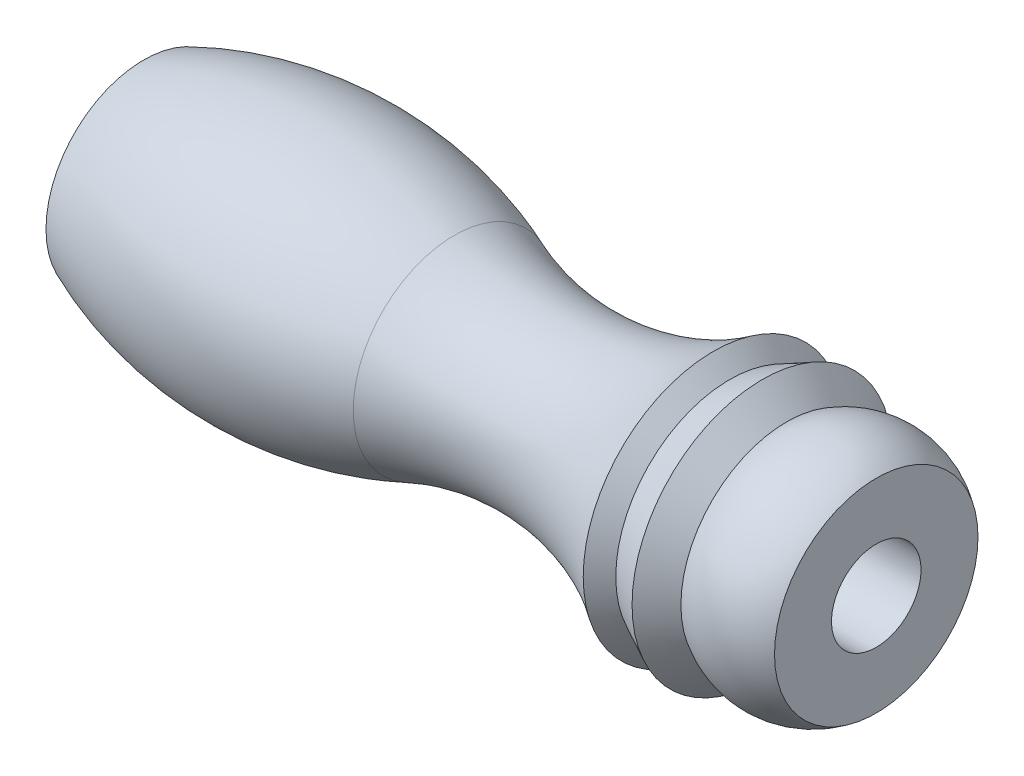
ISO-10303-21;
HEADER;
FILE_DESCRIPTION(('STEP AP214'),'2;1');
FILE_NAME('part.step','',(''),(''),'','','');
FILE_SCHEMA(('AUTOMOTIVE_DESIGN { 1 0 10303 214 1 1 1 1 }'));
ENDSEC;
DATA;
#1=APPLICATION_CONTEXT('core data for automotive mechanical design processes');
#2=APPLICATION_PROTOCOL_DEFINITION('international standard','automotive_design',2000,#1);
#3=PRODUCT_CONTEXT('',#1,'mechanical');
#4=PRODUCT('Part','Part','',(#3));
#5=PRODUCT_RELATED_PRODUCT_CATEGORY('part','',(#4));
#6=PRODUCT_DEFINITION_FORMATION('','',#4);
#7=PRODUCT_DEFINITION_CONTEXT('part definition',#1,'design');
#8=PRODUCT_DEFINITION('design','',#6,#7);
#9=PRODUCT_DEFINITION_SHAPE('','',#8);
#10=(LENGTH_UNIT() NAMED_UNIT(*) SI_UNIT(.MILLI.,.METRE.));
#11=(NAMED_UNIT(*) PLANE_ANGLE_UNIT() SI_UNIT($,.RADIAN.));
#12=(NAMED_UNIT(*) SI_UNIT($,.STERADIAN.) SOLID_ANGLE_UNIT());
#13=UNCERTAINTY_MEASURE_WITH_UNIT(LENGTH_MEASURE(1.E-05),#10,'distance_accuracy_value','');
#14=(GEOMETRIC_REPRESENTATION_CONTEXT(3) GLOBAL_UNCERTAINTY_ASSIGNED_CONTEXT((#13)) GLOBAL_UNIT_ASSIGNED_CONTEXT((#10,
#11,#12)) REPRESENTATION_CONTEXT('',''));
#15=CARTESIAN_POINT('',(0.,0.,0.));
#16=DIRECTION('',(0.,0.,1.));
#17=DIRECTION('',(1.,0.,0.));
#18=AXIS2_PLACEMENT_3D('',#15,#16,#17);
#19=CARTESIAN_POINT('',(0.,0.,0.));
#20=DIRECTION('',(1.,0.,0.));
#21=DIRECTION('',(0.,0.,-1.));
#22=AXIS2_PLACEMENT_3D('',#19,#20,#21);
#23=PLANE('',#22);
#24=CARTESIAN_POINT('',(0.,0.,0.));
#25=DIRECTION('',(1.,0.,0.));
#26=DIRECTION('',(0.,0.,-1.));
#27=AXIS2_PLACEMENT_3D('',#24,#25,#26);
#28=CIRCLE('',#27,5.5);
#29=CARTESIAN_POINT('',(0.,0.,-5.5));
#30=VERTEX_POINT('',#29);
#31=EDGE_CURVE('E78',#30,#30,#28,.T.);
#32=ORIENTED_EDGE('',*,*,#31,.T.);
#33=EDGE_LOOP('',(#32));
#34=FACE_BOUND('',#33,.T.);
#35=CARTESIAN_POINT('',(0.,0.,0.));
#36=DIRECTION('',(-1.,0.,0.));
#37=DIRECTION('',(0.,0.,1.));
#38=AXIS2_PLACEMENT_3D('',#35,#36,#37);
#39=CIRCLE('',#38,12.);
#40=CARTESIAN_POINT('',(0.,0.,12.));
#41=VERTEX_POINT('',#40);
#42=EDGE_CURVE('E10',#41,#41,#39,.T.);
#43=ORIENTED_EDGE('',*,*,#42,.T.);
#44=EDGE_LOOP('',(#43));
#45=FACE_BOUND('',#44,.T.);
#46=ADVANCED_FACE('F43',(#34,#45),#23,.F.);
#47=CARTESIAN_POINT('',(19.5959179422654,0.,0.));
#48=DIRECTION('',(-1.,0.,0.));
#49=DIRECTION('',(0.,0.,1.));
#50=AXIS2_PLACEMENT_3D('',#47,#48,#49);
#51=DEGENERATE_TOROIDAL_SURFACE('',#50,34.,50.,.F.);
#52=ORIENTED_EDGE('',*,*,#42,.F.);
#53=EDGE_LOOP('',(#52));
#54=FACE_BOUND('',#53,.T.);
#55=CARTESIAN_POINT('',(38.1663120568764,0.,0.));
#56=DIRECTION('',(-1.,0.,0.));
#57=DIRECTION('',(0.,0.,1.));
#58=AXIS2_PLACEMENT_3D('',#55,#56,#57);
#59=CIRCLE('',#58,12.4234904162539);
#60=CARTESIAN_POINT('',(38.1663120568764,0.,12.4234904162539));
#61=VERTEX_POINT('',#60);
#62=EDGE_CURVE('E50',#61,#61,#59,.T.);
#63=ORIENTED_EDGE('',*,*,#62,.T.);
#64=EDGE_LOOP('',(#63));
#65=FACE_BOUND('',#64,.T.);
#66=ADVANCED_FACE('F113',(#54,#65),#51,.F.);
#67=CARTESIAN_POINT('',(50.7498578601229,0.,0.));
#68=DIRECTION('',(-1.,0.,0.));
#69=DIRECTION('',(0.,0.,1.));
#70=AXIS2_PLACEMENT_3D('',#67,#68,#69);
#71=TOROIDAL_SURFACE('',#70,43.8806643671227,33.8806643671227);
#72=ORIENTED_EDGE('',*,*,#62,.F.);
#73=EDGE_LOOP('',(#72));
#74=FACE_BOUND('',#73,.T.);
#75=CARTESIAN_POINT('',(70.,0.,0.));
#76=DIRECTION('',(-1.,0.,0.));
#77=DIRECTION('',(0.,0.,1.));
#78=AXIS2_PLACEMENT_3D('',#75,#76,#77);
#79=CIRCLE('',#78,16.);
#80=CARTESIAN_POINT('',(70.,0.,16.));
#81=VERTEX_POINT('',#80);
#82=EDGE_CURVE('E55',#81,#81,#79,.T.);
#83=ORIENTED_EDGE('',*,*,#82,.T.);
#84=EDGE_LOOP('',(#83));
#85=FACE_BOUND('',#84,.T.);
#86=ADVANCED_FACE('F117',(#74,#85),#71,.F.);
#87=CARTESIAN_POINT('',(72.,0.,0.));
#88=DIRECTION('',(-1.,0.,0.));
#89=DIRECTION('',(0.,0.,1.));
#90=AXIS2_PLACEMENT_3D('',#87,#88,#89);
#91=CONICAL_SURFACE('',#90,14.,0.785398163397446);
#92=ORIENTED_EDGE('',*,*,#82,.F.);
#93=EDGE_LOOP('',(#92));
#94=FACE_BOUND('',#93,.T.);
#95=CARTESIAN_POINT('',(72.,0.,0.));
#96=DIRECTION('',(-1.,0.,0.));
#97=DIRECTION('',(0.,0.,1.));
#98=AXIS2_PLACEMENT_3D('',#95,#96,#97);
#99=CIRCLE('',#98,14.);
#100=CARTESIAN_POINT('',(72.,0.,14.));
#101=VERTEX_POINT('',#100);
#102=EDGE_CURVE('E60',#101,#101,#99,.T.);
#103=ORIENTED_EDGE('',*,*,#102,.T.);
#104=EDGE_LOOP('',(#103));
#105=FACE_BOUND('',#104,.T.);
#106=ADVANCED_FACE('F122',(#94,#105),#91,.T.);
#107=CARTESIAN_POINT('',(76.,0.,0.));
#108=DIRECTION('',(1.,0.,0.));
#109=DIRECTION('',(0.,0.,-1.));
#110=AXIS2_PLACEMENT_3D('',#107,#108,#109);
#111=CONICAL_SURFACE('',#110,16.,0.463647609000806);
#112=ORIENTED_EDGE('',*,*,#102,.F.);
#113=EDGE_LOOP('',(#112));
#114=FACE_BOUND('',#113,.T.);
#115=CARTESIAN_POINT('',(76.,0.,0.));
#116=DIRECTION('',(-1.,0.,0.));
#117=DIRECTION('',(0.,0.,1.));
#118=AXIS2_PLACEMENT_3D('',#115,#116,#117);
#119=CIRCLE('',#118,16.);
#120=CARTESIAN_POINT('',(76.,0.,16.));
#121=VERTEX_POINT('',#120);
#122=EDGE_CURVE('E66',#121,#121,#119,.T.);
#123=ORIENTED_EDGE('',*,*,#122,.T.);
#124=EDGE_LOOP('',(#123));
#125=FACE_BOUND('',#124,.T.);
#126=ADVANCED_FACE('F109',(#114,#125),#111,.T.);
#127=CARTESIAN_POINT('',(79.,0.,0.));
#128=DIRECTION('',(-1.,0.,0.));
#129=DIRECTION('',(0.,0.,1.));
#130=AXIS2_PLACEMENT_3D('',#127,#128,#129);
#131=CONICAL_SURFACE('',#130,13.,0.785398163397448);
#132=ORIENTED_EDGE('',*,*,#122,.F.);
#133=EDGE_LOOP('',(#132));
#134=FACE_BOUND('',#133,.T.);
#135=CARTESIAN_POINT('',(79.,0.,0.));
#136=DIRECTION('',(-1.,0.,0.));
#137=DIRECTION('',(0.,0.,1.));
#138=AXIS2_PLACEMENT_3D('',#135,#136,#137);
#139=CIRCLE('',#138,13.);
#140=CARTESIAN_POINT('',(79.,0.,13.));
#141=VERTEX_POINT('',#140);
#142=EDGE_CURVE('E70',#141,#141,#139,.T.);
#143=ORIENTED_EDGE('',*,*,#142,.T.);
#144=EDGE_LOOP('',(#143));
#145=FACE_BOUND('',#144,.T.);
#146=ADVANCED_FACE('F102',(#134,#145),#131,.T.);
#147=CARTESIAN_POINT('',(84.1209412090317,0.,0.));
#148=DIRECTION('',(-1.,0.,0.));
#149=DIRECTION('',(0.,0.,1.));
#150=AXIS2_PLACEMENT_3D('',#147,#148,#149);
#151=DEGENERATE_TOROIDAL_SURFACE('',#150,4.41070659869856,10.,.T.);
#152=ORIENTED_EDGE('',*,*,#142,.F.);
#153=EDGE_LOOP('',(#152));
#154=FACE_BOUND('',#153,.T.);
#155=CARTESIAN_POINT('',(90.,0.,0.));
#156=DIRECTION('',(-1.,0.,0.));
#157=DIRECTION('',(0.,0.,1.));
#158=AXIS2_PLACEMENT_3D('',#155,#156,#157);
#159=CIRCLE('',#158,12.5);
#160=CARTESIAN_POINT('',(90.,0.,12.5));
#161=VERTEX_POINT('',#160);
#162=EDGE_CURVE('E74',#161,#161,#159,.T.);
#163=ORIENTED_EDGE('',*,*,#162,.T.);
#164=EDGE_LOOP('',(#163));
#165=FACE_BOUND('',#164,.T.);
#166=ADVANCED_FACE('F97',(#154,#165),#151,.T.);
#167=CARTESIAN_POINT('',(90.,12.5,0.));
#168=DIRECTION('',(-1.,0.,0.));
#169=DIRECTION('',(0.,0.,1.));
#170=AXIS2_PLACEMENT_3D('',#167,#168,#169);
#171=PLANE('',#170);
#172=CARTESIAN_POINT('',(90.,0.,0.));
#173=DIRECTION('',(1.,0.,0.));
#174=DIRECTION('',(0.,0.,-1.));
#175=AXIS2_PLACEMENT_3D('',#172,#173,#174);
#176=CIRCLE('',#175,5.5);
#177=CARTESIAN_POINT('',(90.,0.,-5.5));
#178=VERTEX_POINT('',#177);
#179=EDGE_CURVE('E79',#178,#178,#176,.T.);
#180=ORIENTED_EDGE('',*,*,#179,.F.);
#181=EDGE_LOOP('',(#180));
#182=FACE_BOUND('',#181,.T.);
#183=ORIENTED_EDGE('',*,*,#162,.F.);
#184=EDGE_LOOP('',(#183));
#185=FACE_BOUND('',#184,.T.);
#186=ADVANCED_FACE('F91',(#182,#185),#171,.F.);
#187=CARTESIAN_POINT('',(0.,0.,0.));
#188=DIRECTION('',(1.,0.,0.));
#189=DIRECTION('',(0.,0.,-1.));
#190=AXIS2_PLACEMENT_3D('',#187,#188,#189);
#191=CYLINDRICAL_SURFACE('',#190,5.5);
#192=CARTESIAN_POINT('',(0.,0.,-5.5));
#193=CARTESIAN_POINT('',(0.937499999999998,0.,-5.5));
#194=CARTESIAN_POINT('',(1.875,0.,-5.5));
#195=CARTESIAN_POINT('',(3.75,0.,-5.5));
#196=CARTESIAN_POINT('',(4.6875,0.,-5.5));
#197=CARTESIAN_POINT('',(6.5625,0.,-5.5));
#198=CARTESIAN_POINT('',(7.5,0.,-5.5));
#199=CARTESIAN_POINT('',(9.375,0.,-5.5));
#200=CARTESIAN_POINT('',(10.3125,0.,-5.5));
#201=CARTESIAN_POINT('',(12.1875,0.,-5.5));
#202=CARTESIAN_POINT('',(13.125,0.,-5.5));
#203=CARTESIAN_POINT('',(15.,0.,-5.5));
#204=CARTESIAN_POINT('',(15.9375,0.,-5.5));
#205=CARTESIAN_POINT('',(17.8125,0.,-5.5));
#206=CARTESIAN_POINT('',(18.75,0.,-5.5));
#207=CARTESIAN_POINT('',(20.625,0.,-5.5));
#208=CARTESIAN_POINT('',(21.5625,0.,-5.5));
#209=CARTESIAN_POINT('',(23.4375,0.,-5.5));
#210=CARTESIAN_POINT('',(24.375,0.,-5.5));
#211=CARTESIAN_POINT('',(26.25,0.,-5.5));
#212=CARTESIAN_POINT('',(27.1875,0.,-5.5));
#213=CARTESIAN_POINT('',(29.0625,0.,-5.5));
#214=CARTESIAN_POINT('',(30.,0.,-5.5));
#215=CARTESIAN_POINT('',(31.875,0.,-5.5));
#216=CARTESIAN_POINT('',(32.8125,0.,-5.5));
#217=CARTESIAN_POINT('',(34.6875,0.,-5.5));
#218=CARTESIAN_POINT('',(35.625,0.,-5.5));
#219=CARTESIAN_POINT('',(37.5,0.,-5.5));
#220=CARTESIAN_POINT('',(38.4375,0.,-5.5));
#221=CARTESIAN_POINT('',(40.3125,0.,-5.5));
#222=CARTESIAN_POINT('',(41.25,0.,-5.5));
#223=CARTESIAN_POINT('',(43.125,0.,-5.5));
#224=CARTESIAN_POINT('',(44.0625,0.,-5.5));
#225=CARTESIAN_POINT('',(45.9375,0.,-5.5));
#226=CARTESIAN_POINT('',(46.875,0.,-5.5));
#227=CARTESIAN_POINT('',(48.75,0.,-5.5));
#228=CARTESIAN_POINT('',(49.6875,0.,-5.5));
#229=CARTESIAN_POINT('',(51.5625,0.,-5.5));
#230=CARTESIAN_POINT('',(52.5,0.,-5.5));
#231=CARTESIAN_POINT('',(54.375,0.,-5.5));
#232=CARTESIAN_POINT('',(55.3125,0.,-5.5));
#233=CARTESIAN_POINT('',(57.1875,0.,-5.5));
#234=CARTESIAN_POINT('',(58.125,0.,-5.5));
#235=CARTESIAN_POINT('',(60.,0.,-5.5));
#236=CARTESIAN_POINT('',(60.9375,0.,-5.5));
#237=CARTESIAN_POINT('',(62.8125,0.,-5.5));
#238=CARTESIAN_POINT('',(63.75,0.,-5.5));
#239=CARTESIAN_POINT('',(65.625,0.,-5.5));
#240=CARTESIAN_POINT('',(66.5625,0.,-5.5));
#241=CARTESIAN_POINT('',(68.4375,0.,-5.5));
#242=CARTESIAN_POINT('',(69.375,0.,-5.5));
#243=CARTESIAN_POINT('',(71.25,0.,-5.5));
#244=CARTESIAN_POINT('',(72.1875,0.,-5.5));
#245=CARTESIAN_POINT('',(74.0625,0.,-5.5));
#246=CARTESIAN_POINT('',(75.,0.,-5.5));
#247=CARTESIAN_POINT('',(76.875,0.,-5.5));
#248=CARTESIAN_POINT('',(77.8125,0.,-5.5));
#249=CARTESIAN_POINT('',(79.6875,0.,-5.5));
#250=CARTESIAN_POINT('',(80.625,0.,-5.5));
#251=CARTESIAN_POINT('',(82.5,0.,-5.5));
#252=CARTESIAN_POINT('',(83.4375,0.,-5.5));
#253=CARTESIAN_POINT('',(85.3125,0.,-5.5));
#254=CARTESIAN_POINT('',(86.25,0.,-5.5));
#255=CARTESIAN_POINT('',(88.125,0.,-5.5));
#256=CARTESIAN_POINT('',(89.0625,0.,-5.5));
#257=CARTESIAN_POINT('',(90.,0.,-5.5));
#258=B_SPLINE_CURVE_WITH_KNOTS('',3,(#192,#193,#194,#195,#196,#197,#198,#199,#200,#201,#202,
#203,#204,#205,#206,#207,#208,#209,#210,#211,#212,#213,#214,#215,#216,#217,#218,#219,#220,#221,
#222,#223,#224,#225,#226,#227,#228,#229,#230,#231,#232,#233,#234,#235,#236,#237,#238,#239,#240,
#241,#242,#243,#244,#245,#246,#247,#248,#249,#250,#251,#252,#253,#254,#255,#256,#257),
.UNSPECIFIED.,.F.,.F.,(4,2,2,2,2,2,2,2,2,2,2,2,2,2,2,2,2,2,2,2,2,2,2,2,2,2,2,2,2,2,2,2,4),(0.,
2.8125,5.625,8.4375,11.25,14.0625,16.875,19.6875,22.5,25.3125,28.125,30.9375,33.75,36.5625,
39.375,42.1875,45.,47.8125,50.625,53.4375,56.25,59.0625,61.875,64.6875,67.5,70.3125,73.125,
75.9375,78.75,81.5625,84.375,87.1875,90.),.UNSPECIFIED.);
#259=EDGE_CURVE('BSEAM88',#30,#178,#258,.T.);
#260=ORIENTED_EDGE('',*,*,#31,.F.);
#261=ORIENTED_EDGE('',*,*,#179,.T.);
#262=ORIENTED_EDGE('',*,*,#259,.T.);
#263=ORIENTED_EDGE('',*,*,#259,.F.);
#264=EDGE_LOOP('',(#260,#262,#261,#263));
#265=FACE_BOUND('',#264,.T.);
#266=ADVANCED_FACE('F88',(#265),#191,.F.);
#267=CLOSED_SHELL('',(#46,#66,#86,#106,#126,#146,#166,#186,#266));
#268=MANIFOLD_SOLID_BREP('B2',#267);
#269=ADVANCED_BREP_SHAPE_REPRESENTATION('',(#18,#268),#14);
#270=SHAPE_DEFINITION_REPRESENTATION(#9,#269);
ENDSEC;
END-ISO-10303-21;
